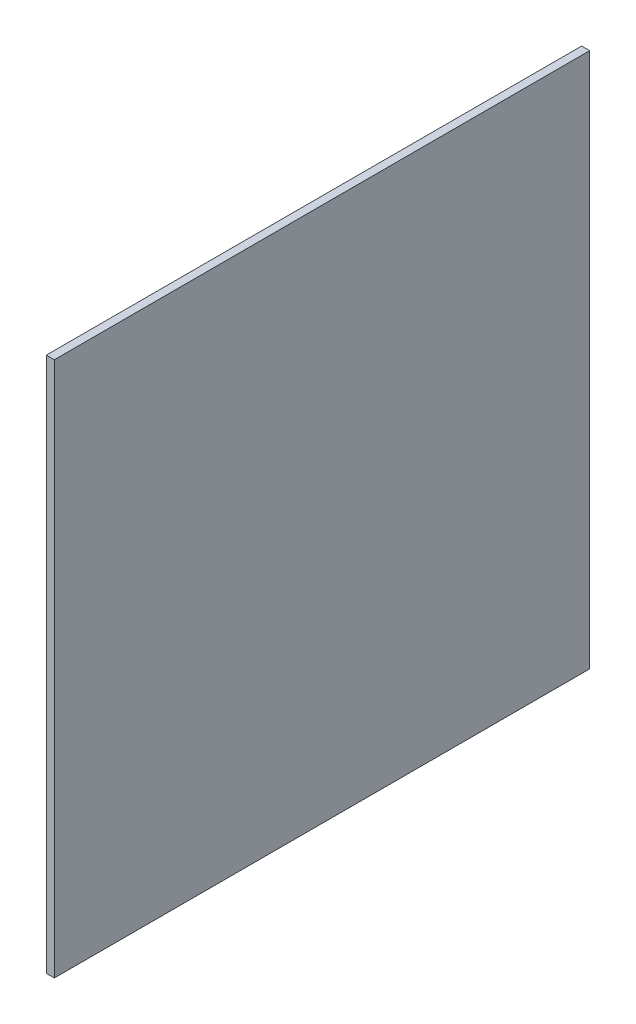
ISO-10303-21;
HEADER;
FILE_DESCRIPTION(('STEP AP214'),'2;1');
FILE_NAME('part.step','',(''),(''),'','','');
FILE_SCHEMA(('AUTOMOTIVE_DESIGN { 1 0 10303 214 1 1 1 1 }'));
ENDSEC;
DATA;
#1=APPLICATION_CONTEXT('core data for automotive mechanical design processes');
#2=APPLICATION_PROTOCOL_DEFINITION('international standard','automotive_design',2000,#1);
#3=PRODUCT_CONTEXT('',#1,'mechanical');
#4=PRODUCT('Part','Part','',(#3));
#5=PRODUCT_RELATED_PRODUCT_CATEGORY('part','',(#4));
#6=PRODUCT_DEFINITION_FORMATION('','',#4);
#7=PRODUCT_DEFINITION_CONTEXT('part definition',#1,'design');
#8=PRODUCT_DEFINITION('design','',#6,#7);
#9=PRODUCT_DEFINITION_SHAPE('','',#8);
#10=(LENGTH_UNIT() NAMED_UNIT(*) SI_UNIT(.MILLI.,.METRE.));
#11=(NAMED_UNIT(*) PLANE_ANGLE_UNIT() SI_UNIT($,.RADIAN.));
#12=(NAMED_UNIT(*) SI_UNIT($,.STERADIAN.) SOLID_ANGLE_UNIT());
#13=UNCERTAINTY_MEASURE_WITH_UNIT(LENGTH_MEASURE(1.E-05),#10,'distance_accuracy_value','');
#14=(GEOMETRIC_REPRESENTATION_CONTEXT(3) GLOBAL_UNCERTAINTY_ASSIGNED_CONTEXT((#13)) GLOBAL_UNIT_ASSIGNED_CONTEXT((#10,
#11,#12)) REPRESENTATION_CONTEXT('',''));
#15=CARTESIAN_POINT('',(0.,0.,0.));
#16=DIRECTION('',(0.,0.,1.));
#17=DIRECTION('',(1.,0.,0.));
#18=AXIS2_PLACEMENT_3D('',#15,#16,#17);
#19=CARTESIAN_POINT('',(30.,1000.,-1000.));
#20=DIRECTION('',(0.,0.,1.));
#21=DIRECTION('',(0.,-1.,0.));
#22=AXIS2_PLACEMENT_3D('',#19,#20,#21);
#23=PLANE('',#22);
#24=DIRECTION('',(0.,1.,0.));
#25=VECTOR('',#24,1.);
#26=CARTESIAN_POINT('',(0.,1000.,-1000.));
#27=LINE('',#26,#25);
#28=CARTESIAN_POINT('',(0.,-1000.,-1000.));
#29=VERTEX_POINT('',#28);
#30=CARTESIAN_POINT('',(0.,1000.,-1000.));
#31=VERTEX_POINT('',#30);
#32=EDGE_CURVE('E100',#29,#31,#27,.T.);
#33=ORIENTED_EDGE('',*,*,#32,.T.);
#34=DIRECTION('',(-1.,0.,0.));
#35=VECTOR('',#34,1.);
#36=CARTESIAN_POINT('',(30.,1000.,-1000.));
#37=LINE('',#36,#35);
#38=CARTESIAN_POINT('',(30.,1000.,-1000.));
#39=VERTEX_POINT('',#38);
#40=EDGE_CURVE('E11',#39,#31,#37,.T.);
#41=ORIENTED_EDGE('',*,*,#40,.F.);
#42=DIRECTION('',(0.,1.,0.));
#43=VECTOR('',#42,1.);
#44=CARTESIAN_POINT('',(30.,1000.,-1000.));
#45=LINE('',#44,#43);
#46=CARTESIAN_POINT('',(30.,-1000.,-1000.));
#47=VERTEX_POINT('',#46);
#48=EDGE_CURVE('E88',#47,#39,#45,.T.);
#49=ORIENTED_EDGE('',*,*,#48,.F.);
#50=DIRECTION('',(-1.,0.,0.));
#51=VECTOR('',#50,1.);
#52=CARTESIAN_POINT('',(30.,-1000.,-1000.));
#53=LINE('',#52,#51);
#54=EDGE_CURVE('E96',#47,#29,#53,.T.);
#55=ORIENTED_EDGE('',*,*,#54,.T.);
#56=EDGE_LOOP('',(#33,#41,#49,#55));
#57=FACE_BOUND('',#56,.T.);
#58=ADVANCED_FACE('F37',(#57),#23,.F.);
#59=CARTESIAN_POINT('',(30.,1000.,1000.));
#60=DIRECTION('',(0.,-1.,0.));
#61=DIRECTION('',(0.,0.,-1.));
#62=AXIS2_PLACEMENT_3D('',#59,#60,#61);
#63=PLANE('',#62);
#64=DIRECTION('',(0.,0.,1.));
#65=VECTOR('',#64,1.);
#66=CARTESIAN_POINT('',(0.,1000.,1000.));
#67=LINE('',#66,#65);
#68=CARTESIAN_POINT('',(0.,1000.,1000.));
#69=VERTEX_POINT('',#68);
#70=EDGE_CURVE('E92',#31,#69,#67,.T.);
#71=ORIENTED_EDGE('',*,*,#70,.T.);
#72=DIRECTION('',(-1.,0.,0.));
#73=VECTOR('',#72,1.);
#74=CARTESIAN_POINT('',(30.,1000.,1000.));
#75=LINE('',#74,#73);
#76=CARTESIAN_POINT('',(30.,1000.,1000.));
#77=VERTEX_POINT('',#76);
#78=EDGE_CURVE('E45',#77,#69,#75,.T.);
#79=ORIENTED_EDGE('',*,*,#78,.F.);
#80=DIRECTION('',(0.,0.,1.));
#81=VECTOR('',#80,1.);
#82=CARTESIAN_POINT('',(30.,1000.,1000.));
#83=LINE('',#82,#81);
#84=EDGE_CURVE('E83',#39,#77,#83,.T.);
#85=ORIENTED_EDGE('',*,*,#84,.F.);
#86=ORIENTED_EDGE('',*,*,#40,.T.);
#87=EDGE_LOOP('',(#71,#79,#85,#86));
#88=FACE_BOUND('',#87,.T.);
#89=ADVANCED_FACE('F91',(#88),#63,.F.);
#90=CARTESIAN_POINT('',(30.,1000.,1000.));
#91=DIRECTION('',(0.,0.,-1.));
#92=DIRECTION('',(0.,1.,0.));
#93=AXIS2_PLACEMENT_3D('',#90,#91,#92);
#94=PLANE('',#93);
#95=DIRECTION('',(0.,-1.,0.));
#96=VECTOR('',#95,1.);
#97=CARTESIAN_POINT('',(0.,1000.,1000.));
#98=LINE('',#97,#96);
#99=CARTESIAN_POINT('',(0.,-1000.,1000.));
#100=VERTEX_POINT('',#99);
#101=EDGE_CURVE('E70',#69,#100,#98,.T.);
#102=ORIENTED_EDGE('',*,*,#101,.T.);
#103=DIRECTION('',(-1.,0.,0.));
#104=VECTOR('',#103,1.);
#105=CARTESIAN_POINT('',(30.,-1000.,1000.));
#106=LINE('',#105,#104);
#107=CARTESIAN_POINT('',(30.,-1000.,1000.));
#108=VERTEX_POINT('',#107);
#109=EDGE_CURVE('E93',#108,#100,#106,.T.);
#110=ORIENTED_EDGE('',*,*,#109,.F.);
#111=DIRECTION('',(0.,-1.,0.));
#112=VECTOR('',#111,1.);
#113=CARTESIAN_POINT('',(30.,1000.,1000.));
#114=LINE('',#113,#112);
#115=EDGE_CURVE('E86',#77,#108,#114,.T.);
#116=ORIENTED_EDGE('',*,*,#115,.F.);
#117=ORIENTED_EDGE('',*,*,#78,.T.);
#118=EDGE_LOOP('',(#102,#110,#116,#117));
#119=FACE_BOUND('',#118,.T.);
#120=ADVANCED_FACE('F94',(#119),#94,.F.);
#121=CARTESIAN_POINT('',(30.,-1000.,1000.));
#122=DIRECTION('',(0.,1.,0.));
#123=DIRECTION('',(0.,0.,1.));
#124=AXIS2_PLACEMENT_3D('',#121,#122,#123);
#125=PLANE('',#124);
#126=DIRECTION('',(0.,0.,-1.));
#127=VECTOR('',#126,1.);
#128=CARTESIAN_POINT('',(0.,-1000.,1000.));
#129=LINE('',#128,#127);
#130=EDGE_CURVE('E76',#100,#29,#129,.T.);
#131=ORIENTED_EDGE('',*,*,#130,.T.);
#132=ORIENTED_EDGE('',*,*,#54,.F.);
#133=DIRECTION('',(0.,0.,-1.));
#134=VECTOR('',#133,1.);
#135=CARTESIAN_POINT('',(30.,-1000.,1000.));
#136=LINE('',#135,#134);
#137=EDGE_CURVE('E53',#108,#47,#136,.T.);
#138=ORIENTED_EDGE('',*,*,#137,.F.);
#139=ORIENTED_EDGE('',*,*,#109,.T.);
#140=EDGE_LOOP('',(#131,#132,#138,#139));
#141=FACE_BOUND('',#140,.T.);
#142=ADVANCED_FACE('F107',(#141),#125,.F.);
#143=CARTESIAN_POINT('',(30.,0.,0.));
#144=DIRECTION('',(1.,0.,0.));
#145=DIRECTION('',(0.,0.,-1.));
#146=AXIS2_PLACEMENT_3D('',#143,#144,#145);
#147=PLANE('',#146);
#148=ORIENTED_EDGE('',*,*,#48,.T.);
#149=ORIENTED_EDGE('',*,*,#84,.T.);
#150=ORIENTED_EDGE('',*,*,#115,.T.);
#151=ORIENTED_EDGE('',*,*,#137,.T.);
#152=EDGE_LOOP('',(#148,#149,#150,#151));
#153=FACE_BOUND('',#152,.T.);
#154=ADVANCED_FACE('F84',(#153),#147,.T.);
#155=CARTESIAN_POINT('',(0.,0.,0.));
#156=DIRECTION('',(1.,0.,0.));
#157=DIRECTION('',(0.,0.,-1.));
#158=AXIS2_PLACEMENT_3D('',#155,#156,#157);
#159=PLANE('',#158);
#160=ORIENTED_EDGE('',*,*,#32,.F.);
#161=ORIENTED_EDGE('',*,*,#130,.F.);
#162=ORIENTED_EDGE('',*,*,#101,.F.);
#163=ORIENTED_EDGE('',*,*,#70,.F.);
#164=EDGE_LOOP('',(#160,#161,#162,#163));
#165=FACE_BOUND('',#164,.T.);
#166=ADVANCED_FACE('F110',(#165),#159,.F.);
#167=CLOSED_SHELL('',(#58,#89,#120,#142,#154,#166));
#168=MANIFOLD_SOLID_BREP('B2',#167);
#169=ADVANCED_BREP_SHAPE_REPRESENTATION('',(#18,#168),#14);
#170=SHAPE_DEFINITION_REPRESENTATION(#9,#169);
ENDSEC;
END-ISO-10303-21;
